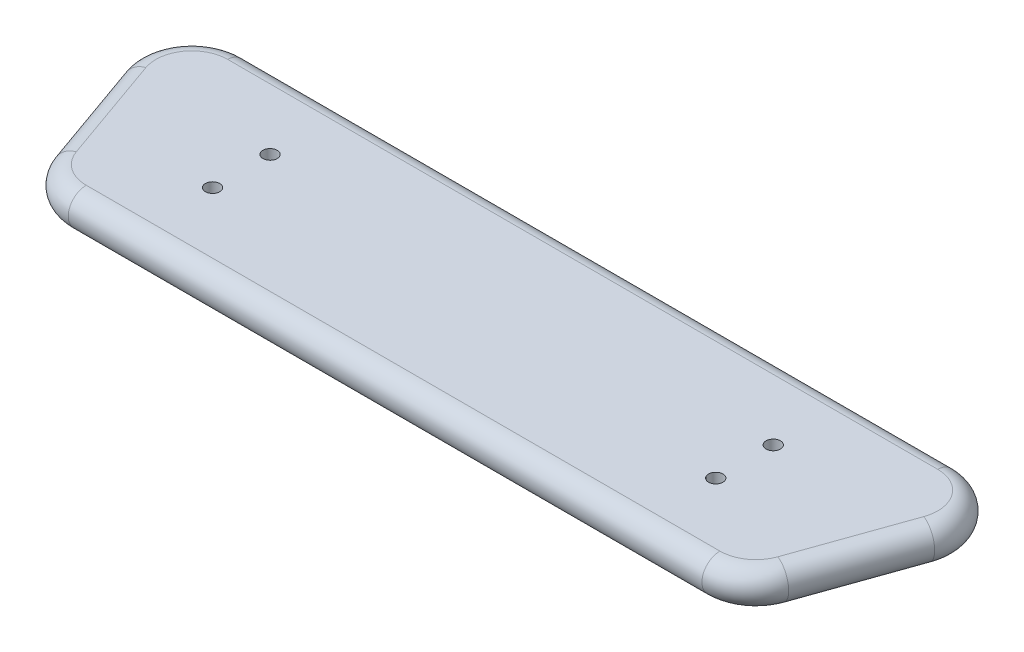
ISO-10303-21;
HEADER;
FILE_DESCRIPTION(('STEP AP214'),'2;1');
FILE_NAME('part.step','',(''),(''),'','','');
FILE_SCHEMA(('AUTOMOTIVE_DESIGN { 1 0 10303 214 1 1 1 1 }'));
ENDSEC;
DATA;
#1=APPLICATION_CONTEXT('core data for automotive mechanical design processes');
#2=APPLICATION_PROTOCOL_DEFINITION('international standard','automotive_design',2000,#1);
#3=PRODUCT_CONTEXT('',#1,'mechanical');
#4=PRODUCT('Part','Part','',(#3));
#5=PRODUCT_RELATED_PRODUCT_CATEGORY('part','',(#4));
#6=PRODUCT_DEFINITION_FORMATION('','',#4);
#7=PRODUCT_DEFINITION_CONTEXT('part definition',#1,'design');
#8=PRODUCT_DEFINITION('design','',#6,#7);
#9=PRODUCT_DEFINITION_SHAPE('','',#8);
#10=(LENGTH_UNIT() NAMED_UNIT(*) SI_UNIT(.MILLI.,.METRE.));
#11=(NAMED_UNIT(*) PLANE_ANGLE_UNIT() SI_UNIT($,.RADIAN.));
#12=(NAMED_UNIT(*) SI_UNIT($,.STERADIAN.) SOLID_ANGLE_UNIT());
#13=UNCERTAINTY_MEASURE_WITH_UNIT(LENGTH_MEASURE(1.E-05),#10,'distance_accuracy_value','');
#14=(GEOMETRIC_REPRESENTATION_CONTEXT(3) GLOBAL_UNCERTAINTY_ASSIGNED_CONTEXT((#13)) GLOBAL_UNIT_ASSIGNED_CONTEXT((#10,
#11,#12)) REPRESENTATION_CONTEXT('',''));
#15=CARTESIAN_POINT('',(0.,0.,0.));
#16=DIRECTION('',(0.,0.,1.));
#17=DIRECTION('',(1.,0.,0.));
#18=AXIS2_PLACEMENT_3D('',#15,#16,#17);
#19=CARTESIAN_POINT('',(-88.1519337423437,5.,19.9928971114934));
#20=DIRECTION('',(1.,0.,0.));
#21=DIRECTION('',(0.,0.,-1.));
#22=AXIS2_PLACEMENT_3D('',#19,#20,#21);
#23=CYLINDRICAL_SURFACE('',#22,5.);
#24=CARTESIAN_POINT('',(88.1519337423434,5.,19.9928971114934));
#25=DIRECTION('',(1.,0.,0.));
#26=DIRECTION('',(0.,0.,-1.));
#27=AXIS2_PLACEMENT_3D('',#24,#25,#26);
#28=CIRCLE('',#27,5.);
#29=CARTESIAN_POINT('',(88.1519337423434,10.,19.9928971114934));
#30=VERTEX_POINT('',#29);
#31=CARTESIAN_POINT('',(88.1519337423434,0.,19.9928971114934));
#32=VERTEX_POINT('',#31);
#33=EDGE_CURVE('E11',#30,#32,#28,.T.);
#34=ORIENTED_EDGE('',*,*,#33,.F.);
#35=DIRECTION('',(1.,0.,0.));
#36=VECTOR('',#35,1.);
#37=CARTESIAN_POINT('',(88.1519337423434,10.,19.9928971114934));
#38=LINE('',#37,#36);
#39=CARTESIAN_POINT('',(-88.1519337423437,10.,19.9928971114934));
#40=VERTEX_POINT('',#39);
#41=EDGE_CURVE('E125',#40,#30,#38,.T.);
#42=ORIENTED_EDGE('',*,*,#41,.F.);
#43=CARTESIAN_POINT('',(-88.1519337423437,5.,19.9928971114934));
#44=DIRECTION('',(1.,0.,0.));
#45=DIRECTION('',(0.,0.,-1.));
#46=AXIS2_PLACEMENT_3D('',#43,#44,#45);
#47=CIRCLE('',#46,5.);
#48=CARTESIAN_POINT('',(-88.1519337423437,0.,19.9928971114934));
#49=VERTEX_POINT('',#48);
#50=EDGE_CURVE('E53',#40,#49,#47,.T.);
#51=ORIENTED_EDGE('',*,*,#50,.T.);
#52=DIRECTION('',(-1.,0.,0.));
#53=VECTOR('',#52,1.);
#54=CARTESIAN_POINT('',(-88.1519337423437,0.,19.9928971114934));
#55=LINE('',#54,#53);
#56=EDGE_CURVE('E152',#32,#49,#55,.T.);
#57=ORIENTED_EDGE('',*,*,#56,.F.);
#58=EDGE_LOOP('',(#34,#42,#51,#57));
#59=FACE_BOUND('',#58,.T.);
#60=ADVANCED_FACE('F45',(#59),#23,.T.);
#61=CARTESIAN_POINT('',(-88.1519337423437,5.,9.99289711149338));
#62=DIRECTION('',(0.,1.,0.));
#63=DIRECTION('',(0.,0.,1.));
#64=AXIS2_PLACEMENT_3D('',#61,#62,#63);
#65=TOROIDAL_SURFACE('',#64,10.,5.);
#66=ORIENTED_EDGE('',*,*,#50,.F.);
#67=CARTESIAN_POINT('',(-88.1519337423437,10.,9.99289711149338));
#68=DIRECTION('',(0.,-1.,0.));
#69=DIRECTION('',(0.,0.,-1.));
#70=AXIS2_PLACEMENT_3D('',#67,#68,#69);
#71=CIRCLE('',#70,10.);
#72=CARTESIAN_POINT('',(-97.5783486532655,10.,13.3309657038311));
#73=VERTEX_POINT('',#72);
#74=EDGE_CURVE('E112',#73,#40,#71,.F.);
#75=ORIENTED_EDGE('',*,*,#74,.F.);
#76=CARTESIAN_POINT('',(-97.5783486532655,5.,13.3309657038311));
#77=DIRECTION('',(0.333806859233767,0.,0.94264149109218));
#78=DIRECTION('',(0.94264149109218,0.,-0.333806859233767));
#79=AXIS2_PLACEMENT_3D('',#76,#77,#78);
#80=CIRCLE('',#79,5.);
#81=CARTESIAN_POINT('',(-97.5783486532655,0.,13.3309657038311));
#82=VERTEX_POINT('',#81);
#83=EDGE_CURVE('E119',#73,#82,#80,.T.);
#84=ORIENTED_EDGE('',*,*,#83,.T.);
#85=CARTESIAN_POINT('',(-88.1519337423437,0.,9.99289711149338));
#86=DIRECTION('',(0.,-1.,0.));
#87=DIRECTION('',(0.,0.,-1.));
#88=AXIS2_PLACEMENT_3D('',#85,#86,#87);
#89=CIRCLE('',#88,10.);
#90=EDGE_CURVE('E114',#49,#82,#89,.T.);
#91=ORIENTED_EDGE('',*,*,#90,.F.);
#92=EDGE_LOOP('',(#66,#75,#84,#91));
#93=FACE_BOUND('',#92,.T.);
#94=ADVANCED_FACE('F111',(#93),#65,.T.);
#95=CARTESIAN_POINT('',(-108.201905829186,5.,-16.6690342961689));
#96=DIRECTION('',(0.333806859233768,0.,0.94264149109218));
#97=DIRECTION('',(0.94264149109218,0.,-0.333806859233768));
#98=AXIS2_PLACEMENT_3D('',#95,#96,#97);
#99=CYLINDRICAL_SURFACE('',#98,5.);
#100=ORIENTED_EDGE('',*,*,#83,.F.);
#101=DIRECTION('',(0.333806859233768,0.,0.94264149109218));
#102=VECTOR('',#101,1.);
#103=CARTESIAN_POINT('',(-77.9333342134071,10.,68.8067751183617));
#104=LINE('',#103,#102);
#105=CARTESIAN_POINT('',(-108.201905829186,10.,-16.6690342961689));
#106=VERTEX_POINT('',#105);
#107=EDGE_CURVE('E128',#106,#73,#104,.T.);
#108=ORIENTED_EDGE('',*,*,#107,.F.);
#109=CARTESIAN_POINT('',(-108.201905829186,5.,-16.6690342961689));
#110=DIRECTION('',(0.333806859233768,0.,0.942641491092179));
#111=DIRECTION('',(0.942641491092179,0.,-0.333806859233768));
#112=AXIS2_PLACEMENT_3D('',#109,#110,#111);
#113=CIRCLE('',#112,5.);
#114=CARTESIAN_POINT('',(-108.201905829186,0.,-16.6690342961689));
#115=VERTEX_POINT('',#114);
#116=EDGE_CURVE('E179',#106,#115,#113,.T.);
#117=ORIENTED_EDGE('',*,*,#116,.T.);
#118=DIRECTION('',(-0.333806859233768,0.,-0.94264149109218));
#119=VECTOR('',#118,1.);
#120=CARTESIAN_POINT('',(-108.201905829186,0.,-16.6690342961689));
#121=LINE('',#120,#119);
#122=EDGE_CURVE('E155',#82,#115,#121,.T.);
#123=ORIENTED_EDGE('',*,*,#122,.F.);
#124=EDGE_LOOP('',(#100,#108,#117,#123));
#125=FACE_BOUND('',#124,.T.);
#126=ADVANCED_FACE('F183',(#125),#99,.T.);
#127=CARTESIAN_POINT('',(-98.7754909182645,5.,-20.0071028885066));
#128=DIRECTION('',(0.,1.,0.));
#129=DIRECTION('',(0.,0.,1.));
#130=AXIS2_PLACEMENT_3D('',#127,#128,#129);
#131=TOROIDAL_SURFACE('',#130,10.,5.);
#132=ORIENTED_EDGE('',*,*,#116,.F.);
#133=CARTESIAN_POINT('',(-98.7754909182645,10.,-20.0071028885066));
#134=DIRECTION('',(0.,-1.,0.));
#135=DIRECTION('',(0.,0.,-1.));
#136=AXIS2_PLACEMENT_3D('',#133,#134,#135);
#137=CIRCLE('',#136,10.);
#138=CARTESIAN_POINT('',(-98.7754909182645,10.,-30.0071028885066));
#139=VERTEX_POINT('',#138);
#140=EDGE_CURVE('E139',#139,#106,#137,.F.);
#141=ORIENTED_EDGE('',*,*,#140,.F.);
#142=CARTESIAN_POINT('',(-98.7754909182645,5.,-30.0071028885066));
#143=DIRECTION('',(-1.,0.,0.));
#144=DIRECTION('',(0.,-1.,0.));
#145=AXIS2_PLACEMENT_3D('',#142,#143,#144);
#146=CIRCLE('',#145,5.);
#147=CARTESIAN_POINT('',(-98.7754909182645,0.,-30.0071028885066));
#148=VERTEX_POINT('',#147);
#149=EDGE_CURVE('E177',#139,#148,#146,.T.);
#150=ORIENTED_EDGE('',*,*,#149,.T.);
#151=CARTESIAN_POINT('',(-98.7754909182645,0.,-20.0071028885066));
#152=DIRECTION('',(0.,-1.,0.));
#153=DIRECTION('',(0.,0.,-1.));
#154=AXIS2_PLACEMENT_3D('',#151,#152,#153);
#155=CIRCLE('',#154,10.);
#156=EDGE_CURVE('E158',#115,#148,#155,.T.);
#157=ORIENTED_EDGE('',*,*,#156,.F.);
#158=EDGE_LOOP('',(#132,#141,#150,#157));
#159=FACE_BOUND('',#158,.T.);
#160=ADVANCED_FACE('F197',(#159),#131,.T.);
#161=CARTESIAN_POINT('',(98.7754909182645,5.,-30.0071028885066));
#162=DIRECTION('',(-1.,0.,0.));
#163=DIRECTION('',(0.,0.,1.));
#164=AXIS2_PLACEMENT_3D('',#161,#162,#163);
#165=CYLINDRICAL_SURFACE('',#164,5.);
#166=ORIENTED_EDGE('',*,*,#149,.F.);
#167=DIRECTION('',(-1.,0.,0.));
#168=VECTOR('',#167,1.);
#169=CARTESIAN_POINT('',(88.1519337423434,10.,-30.0071028885067));
#170=LINE('',#169,#168);
#171=CARTESIAN_POINT('',(98.7754909182645,10.,-30.0071028885067));
#172=VERTEX_POINT('',#171);
#173=EDGE_CURVE('E141',#172,#139,#170,.T.);
#174=ORIENTED_EDGE('',*,*,#173,.F.);
#175=CARTESIAN_POINT('',(98.7754909182645,5.,-30.0071028885066));
#176=DIRECTION('',(-1.,0.,0.));
#177=DIRECTION('',(0.,0.,1.));
#178=AXIS2_PLACEMENT_3D('',#175,#176,#177);
#179=CIRCLE('',#178,5.);
#180=CARTESIAN_POINT('',(98.7754909182645,0.,-30.0071028885067));
#181=VERTEX_POINT('',#180);
#182=EDGE_CURVE('E175',#172,#181,#179,.T.);
#183=ORIENTED_EDGE('',*,*,#182,.T.);
#184=DIRECTION('',(1.,0.,0.));
#185=VECTOR('',#184,1.);
#186=CARTESIAN_POINT('',(98.7754909182645,0.,-30.0071028885066));
#187=LINE('',#186,#185);
#188=EDGE_CURVE('E161',#148,#181,#187,.T.);
#189=ORIENTED_EDGE('',*,*,#188,.F.);
#190=EDGE_LOOP('',(#166,#174,#183,#189));
#191=FACE_BOUND('',#190,.T.);
#192=ADVANCED_FACE('F195',(#191),#165,.T.);
#193=CARTESIAN_POINT('',(98.7754909182645,5.,-20.0071028885066));
#194=DIRECTION('',(0.,1.,0.));
#195=DIRECTION('',(0.,0.,1.));
#196=AXIS2_PLACEMENT_3D('',#193,#194,#195);
#197=TOROIDAL_SURFACE('',#196,10.,5.);
#198=ORIENTED_EDGE('',*,*,#182,.F.);
#199=CARTESIAN_POINT('',(98.7754909182645,10.,-20.0071028885066));
#200=DIRECTION('',(0.,-1.,0.));
#201=DIRECTION('',(0.,0.,-1.));
#202=AXIS2_PLACEMENT_3D('',#199,#200,#201);
#203=CIRCLE('',#202,10.);
#204=CARTESIAN_POINT('',(108.201905829186,10.,-16.6690342961689));
#205=VERTEX_POINT('',#204);
#206=EDGE_CURVE('E144',#205,#172,#203,.F.);
#207=ORIENTED_EDGE('',*,*,#206,.F.);
#208=CARTESIAN_POINT('',(108.201905829186,5.,-16.6690342961689));
#209=DIRECTION('',(0.333806859233774,0.,-0.942641491092177));
#210=DIRECTION('',(-0.942641491092177,0.,-0.333806859233774));
#211=AXIS2_PLACEMENT_3D('',#208,#209,#210);
#212=CIRCLE('',#211,5.);
#213=CARTESIAN_POINT('',(108.201905829186,0.,-16.6690342961689));
#214=VERTEX_POINT('',#213);
#215=EDGE_CURVE('E68',#205,#214,#212,.T.);
#216=ORIENTED_EDGE('',*,*,#215,.T.);
#217=CARTESIAN_POINT('',(98.7754909182645,0.,-20.0071028885066));
#218=DIRECTION('',(0.,-1.,0.));
#219=DIRECTION('',(0.,0.,-1.));
#220=AXIS2_PLACEMENT_3D('',#217,#218,#219);
#221=CIRCLE('',#220,10.);
#222=EDGE_CURVE('E164',#181,#214,#221,.T.);
#223=ORIENTED_EDGE('',*,*,#222,.F.);
#224=EDGE_LOOP('',(#198,#207,#216,#223));
#225=FACE_BOUND('',#224,.T.);
#226=ADVANCED_FACE('F191',(#225),#197,.T.);
#227=CARTESIAN_POINT('',(97.5783486532652,5.,13.3309657038312));
#228=DIRECTION('',(0.333806859233775,0.,-0.942641491092177));
#229=DIRECTION('',(-0.942641491092177,0.,-0.333806859233775));
#230=AXIS2_PLACEMENT_3D('',#227,#228,#229);
#231=CYLINDRICAL_SURFACE('',#230,5.);
#232=ORIENTED_EDGE('',*,*,#215,.F.);
#233=DIRECTION('',(0.333806859233775,0.,-0.942641491092177));
#234=VECTOR('',#233,1.);
#235=CARTESIAN_POINT('',(97.5783486532652,10.,13.3309657038312));
#236=LINE('',#235,#234);
#237=CARTESIAN_POINT('',(97.5783486532652,10.,13.3309657038312));
#238=VERTEX_POINT('',#237);
#239=EDGE_CURVE('E147',#238,#205,#236,.T.);
#240=ORIENTED_EDGE('',*,*,#239,.F.);
#241=CARTESIAN_POINT('',(97.5783486532652,5.,13.3309657038312));
#242=DIRECTION('',(0.333806859233775,0.,-0.942641491092177));
#243=DIRECTION('',(-0.942641491092177,0.,-0.333806859233775));
#244=AXIS2_PLACEMENT_3D('',#241,#242,#243);
#245=CIRCLE('',#244,5.);
#246=CARTESIAN_POINT('',(97.5783486532652,0.,13.3309657038312));
#247=VERTEX_POINT('',#246);
#248=EDGE_CURVE('E60',#238,#247,#245,.T.);
#249=ORIENTED_EDGE('',*,*,#248,.T.);
#250=DIRECTION('',(-0.333806859233775,0.,0.942641491092177));
#251=VECTOR('',#250,1.);
#252=CARTESIAN_POINT('',(97.5783486532652,0.,13.3309657038312));
#253=LINE('',#252,#251);
#254=EDGE_CURVE('E167',#214,#247,#253,.T.);
#255=ORIENTED_EDGE('',*,*,#254,.F.);
#256=EDGE_LOOP('',(#232,#240,#249,#255));
#257=FACE_BOUND('',#256,.T.);
#258=ADVANCED_FACE('F189',(#257),#231,.T.);
#259=CARTESIAN_POINT('',(88.1519337423434,5.,9.99289711149341));
#260=DIRECTION('',(0.,1.,0.));
#261=DIRECTION('',(0.,0.,1.));
#262=AXIS2_PLACEMENT_3D('',#259,#260,#261);
#263=TOROIDAL_SURFACE('',#262,10.,5.);
#264=CARTESIAN_POINT('',(88.1519337423434,10.,9.99289711149341));
#265=DIRECTION('',(0.,-1.,0.));
#266=DIRECTION('',(0.,0.,-1.));
#267=AXIS2_PLACEMENT_3D('',#264,#265,#266);
#268=CIRCLE('',#267,10.);
#269=EDGE_CURVE('E150',#30,#238,#268,.F.);
#270=ORIENTED_EDGE('',*,*,#269,.F.);
#271=ORIENTED_EDGE('',*,*,#33,.T.);
#272=CARTESIAN_POINT('',(88.1519337423434,0.,9.99289711149341));
#273=DIRECTION('',(0.,-1.,0.));
#274=DIRECTION('',(0.,0.,-1.));
#275=AXIS2_PLACEMENT_3D('',#272,#273,#274);
#276=CIRCLE('',#275,10.);
#277=EDGE_CURVE('E170',#247,#32,#276,.T.);
#278=ORIENTED_EDGE('',*,*,#277,.F.);
#279=ORIENTED_EDGE('',*,*,#248,.F.);
#280=EDGE_LOOP('',(#270,#271,#278,#279));
#281=FACE_BOUND('',#280,.T.);
#282=ADVANCED_FACE('F188',(#281),#263,.T.);
#283=CARTESIAN_POINT('',(88.1519337423434,10.,9.99289711149341));
#284=DIRECTION('',(0.,-1.,0.));
#285=DIRECTION('',(0.,0.,-1.));
#286=AXIS2_PLACEMENT_3D('',#283,#284,#285);
#287=PLANE('',#286);
#288=CARTESIAN_POINT('',(69.9999999999999,10.,2.99289711149415));
#289=DIRECTION('',(0.,-1.,0.));
#290=DIRECTION('',(0.,0.,1.));
#291=AXIS2_PLACEMENT_3D('',#288,#289,#290);
#292=CIRCLE('',#291,1.99999999999999);
#293=CARTESIAN_POINT('',(69.9999999999999,10.,4.99289711149414));
#294=VERTEX_POINT('',#293);
#295=EDGE_CURVE('E296',#294,#294,#292,.T.);
#296=ORIENTED_EDGE('',*,*,#295,.T.);
#297=EDGE_LOOP('',(#296));
#298=FACE_BOUND('',#297,.T.);
#299=CARTESIAN_POINT('',(70.,10.,-13.0071028885059));
#300=DIRECTION('',(0.,-1.,0.));
#301=DIRECTION('',(0.,0.,-1.));
#302=AXIS2_PLACEMENT_3D('',#299,#300,#301);
#303=CIRCLE('',#302,2.);
#304=CARTESIAN_POINT('',(70.,10.,-15.0071028885059));
#305=VERTEX_POINT('',#304);
#306=EDGE_CURVE('E290',#305,#305,#303,.T.);
#307=ORIENTED_EDGE('',*,*,#306,.T.);
#308=EDGE_LOOP('',(#307));
#309=FACE_BOUND('',#308,.T.);
#310=CARTESIAN_POINT('',(-70.,10.,-13.0071028885066));
#311=DIRECTION('',(0.,-1.,0.));
#312=DIRECTION('',(0.,0.,1.));
#313=AXIS2_PLACEMENT_3D('',#310,#311,#312);
#314=CIRCLE('',#313,2.);
#315=CARTESIAN_POINT('',(-70.,10.,-11.0071028885066));
#316=VERTEX_POINT('',#315);
#317=EDGE_CURVE('E279',#316,#316,#314,.T.);
#318=ORIENTED_EDGE('',*,*,#317,.T.);
#319=EDGE_LOOP('',(#318));
#320=FACE_BOUND('',#319,.T.);
#321=CARTESIAN_POINT('',(-70.,10.,2.99289711149337));
#322=DIRECTION('',(0.,-1.,0.));
#323=DIRECTION('',(0.,0.,-1.));
#324=AXIS2_PLACEMENT_3D('',#321,#322,#323);
#325=CIRCLE('',#324,2.);
#326=CARTESIAN_POINT('',(-70.,10.,0.992897111493374));
#327=VERTEX_POINT('',#326);
#328=EDGE_CURVE('E131',#327,#327,#325,.T.);
#329=ORIENTED_EDGE('',*,*,#328,.T.);
#330=EDGE_LOOP('',(#329));
#331=FACE_BOUND('',#330,.T.);
#332=ORIENTED_EDGE('',*,*,#41,.T.);
#333=ORIENTED_EDGE('',*,*,#269,.T.);
#334=ORIENTED_EDGE('',*,*,#239,.T.);
#335=ORIENTED_EDGE('',*,*,#206,.T.);
#336=ORIENTED_EDGE('',*,*,#173,.T.);
#337=ORIENTED_EDGE('',*,*,#140,.T.);
#338=ORIENTED_EDGE('',*,*,#107,.T.);
#339=ORIENTED_EDGE('',*,*,#74,.T.);
#340=EDGE_LOOP('',(#332,#333,#334,#335,#336,#337,#338,#339));
#341=FACE_BOUND('',#340,.T.);
#342=ADVANCED_FACE('F123',(#298,#309,#320,#331,#341),#287,.F.);
#343=CARTESIAN_POINT('',(88.1519337423434,0.,9.99289711149341));
#344=DIRECTION('',(0.,-1.,0.));
#345=DIRECTION('',(0.,0.,-1.));
#346=AXIS2_PLACEMENT_3D('',#343,#344,#345);
#347=PLANE('',#346);
#348=ORIENTED_EDGE('',*,*,#254,.T.);
#349=ORIENTED_EDGE('',*,*,#277,.T.);
#350=ORIENTED_EDGE('',*,*,#56,.T.);
#351=ORIENTED_EDGE('',*,*,#90,.T.);
#352=ORIENTED_EDGE('',*,*,#122,.T.);
#353=ORIENTED_EDGE('',*,*,#156,.T.);
#354=ORIENTED_EDGE('',*,*,#188,.T.);
#355=ORIENTED_EDGE('',*,*,#222,.T.);
#356=EDGE_LOOP('',(#348,#349,#350,#351,#352,#353,#354,#355));
#357=FACE_BOUND('',#356,.T.);
#358=ADVANCED_FACE('F186',(#357),#347,.T.);
#359=CARTESIAN_POINT('',(-70.,10.,2.99289711149337));
#360=DIRECTION('',(0.,-1.,0.));
#361=DIRECTION('',(0.,0.,-1.));
#362=AXIS2_PLACEMENT_3D('',#359,#360,#361);
#363=CYLINDRICAL_SURFACE('',#362,2.);
#364=ORIENTED_EDGE('',*,*,#328,.F.);
#365=EDGE_LOOP('',(#364));
#366=FACE_BOUND('',#365,.T.);
#367=CARTESIAN_POINT('',(-70.,2.,2.99289711149337));
#368=DIRECTION('',(0.,-1.,0.));
#369=DIRECTION('',(0.,0.,-1.));
#370=AXIS2_PLACEMENT_3D('',#367,#368,#369);
#371=CIRCLE('',#370,2.);
#372=CARTESIAN_POINT('',(-70.,2.,0.992897111493374));
#373=VERTEX_POINT('',#372);
#374=EDGE_CURVE('E134',#373,#373,#371,.T.);
#375=ORIENTED_EDGE('',*,*,#374,.T.);
#376=EDGE_LOOP('',(#375));
#377=FACE_BOUND('',#376,.T.);
#378=ADVANCED_FACE('F240',(#366,#377),#363,.F.);
#379=CARTESIAN_POINT('',(-70.,2.,2.99289711149337));
#380=DIRECTION('',(0.,-1.,0.));
#381=DIRECTION('',(0.,0.,-1.));
#382=AXIS2_PLACEMENT_3D('',#379,#380,#381);
#383=PLANE('',#382);
#384=ORIENTED_EDGE('',*,*,#374,.F.);
#385=EDGE_LOOP('',(#384));
#386=FACE_BOUND('',#385,.T.);
#387=ADVANCED_FACE('F246',(#386),#383,.F.);
#388=CARTESIAN_POINT('',(-70.,10.,-13.0071028885066));
#389=DIRECTION('',(0.,-1.,0.));
#390=DIRECTION('',(0.,0.,-1.));
#391=AXIS2_PLACEMENT_3D('',#388,#389,#390);
#392=CYLINDRICAL_SURFACE('',#391,2.);
#393=ORIENTED_EDGE('',*,*,#317,.F.);
#394=EDGE_LOOP('',(#393));
#395=FACE_BOUND('',#394,.T.);
#396=CARTESIAN_POINT('',(-70.,2.,-13.0071028885066));
#397=DIRECTION('',(0.,-1.,0.));
#398=DIRECTION('',(0.,0.,1.));
#399=AXIS2_PLACEMENT_3D('',#396,#397,#398);
#400=CIRCLE('',#399,2.);
#401=CARTESIAN_POINT('',(-70.,2.,-11.0071028885066));
#402=VERTEX_POINT('',#401);
#403=EDGE_CURVE('E282',#402,#402,#400,.T.);
#404=ORIENTED_EDGE('',*,*,#403,.T.);
#405=EDGE_LOOP('',(#404));
#406=FACE_BOUND('',#405,.T.);
#407=ADVANCED_FACE('F250',(#395,#406),#392,.F.);
#408=CARTESIAN_POINT('',(-70.,2.,-13.0071028885066));
#409=DIRECTION('',(0.,1.,0.));
#410=DIRECTION('',(0.,0.,1.));
#411=AXIS2_PLACEMENT_3D('',#408,#409,#410);
#412=PLANE('',#411);
#413=ORIENTED_EDGE('',*,*,#403,.F.);
#414=EDGE_LOOP('',(#413));
#415=FACE_BOUND('',#414,.T.);
#416=ADVANCED_FACE('F267',(#415),#412,.T.);
#417=CARTESIAN_POINT('',(70.,10.,-13.0071028885059));
#418=DIRECTION('',(0.,-1.,0.));
#419=DIRECTION('',(0.,0.,-1.));
#420=AXIS2_PLACEMENT_3D('',#417,#418,#419);
#421=CYLINDRICAL_SURFACE('',#420,2.);
#422=ORIENTED_EDGE('',*,*,#306,.F.);
#423=EDGE_LOOP('',(#422));
#424=FACE_BOUND('',#423,.T.);
#425=CARTESIAN_POINT('',(70.,2.,-13.0071028885059));
#426=DIRECTION('',(0.,-1.,0.));
#427=DIRECTION('',(0.,0.,-1.));
#428=AXIS2_PLACEMENT_3D('',#425,#426,#427);
#429=CIRCLE('',#428,2.);
#430=CARTESIAN_POINT('',(70.,2.,-15.0071028885059));
#431=VERTEX_POINT('',#430);
#432=EDGE_CURVE('E285',#431,#431,#429,.T.);
#433=ORIENTED_EDGE('',*,*,#432,.T.);
#434=EDGE_LOOP('',(#433));
#435=FACE_BOUND('',#434,.T.);
#436=ADVANCED_FACE('F263',(#424,#435),#421,.F.);
#437=CARTESIAN_POINT('',(70.,2.,-13.0071028885059));
#438=DIRECTION('',(0.,-1.,0.));
#439=DIRECTION('',(0.,0.,-1.));
#440=AXIS2_PLACEMENT_3D('',#437,#438,#439);
#441=PLANE('',#440);
#442=ORIENTED_EDGE('',*,*,#432,.F.);
#443=EDGE_LOOP('',(#442));
#444=FACE_BOUND('',#443,.T.);
#445=ADVANCED_FACE('F259',(#444),#441,.F.);
#446=CARTESIAN_POINT('',(69.9999999999999,10.,2.99289711149415));
#447=DIRECTION('',(0.,-1.,0.));
#448=DIRECTION('',(0.,0.,-1.));
#449=AXIS2_PLACEMENT_3D('',#446,#447,#448);
#450=CYLINDRICAL_SURFACE('',#449,1.99999999999999);
#451=ORIENTED_EDGE('',*,*,#295,.F.);
#452=EDGE_LOOP('',(#451));
#453=FACE_BOUND('',#452,.T.);
#454=CARTESIAN_POINT('',(69.9999999999999,2.,2.99289711149415));
#455=DIRECTION('',(0.,-1.,0.));
#456=DIRECTION('',(0.,0.,1.));
#457=AXIS2_PLACEMENT_3D('',#454,#455,#456);
#458=CIRCLE('',#457,1.99999999999999);
#459=CARTESIAN_POINT('',(69.9999999999999,2.,4.99289711149414));
#460=VERTEX_POINT('',#459);
#461=EDGE_CURVE('E293',#460,#460,#458,.T.);
#462=ORIENTED_EDGE('',*,*,#461,.T.);
#463=EDGE_LOOP('',(#462));
#464=FACE_BOUND('',#463,.T.);
#465=ADVANCED_FACE('F255',(#453,#464),#450,.F.);
#466=CARTESIAN_POINT('',(69.9999999999999,2.,2.99289711149415));
#467=DIRECTION('',(0.,1.,0.));
#468=DIRECTION('',(0.,0.,1.));
#469=AXIS2_PLACEMENT_3D('',#466,#467,#468);
#470=PLANE('',#469);
#471=ORIENTED_EDGE('',*,*,#461,.F.);
#472=EDGE_LOOP('',(#471));
#473=FACE_BOUND('',#472,.T.);
#474=ADVANCED_FACE('F252',(#473),#470,.T.);
#475=CLOSED_SHELL('',(#60,#94,#126,#160,#192,#226,#258,#282,#342,#358,#378,#387,#407,#416,#436,
#445,#465,#474));
#476=MANIFOLD_SOLID_BREP('B2',#475);
#477=ADVANCED_BREP_SHAPE_REPRESENTATION('',(#18,#476),#14);
#478=SHAPE_DEFINITION_REPRESENTATION(#9,#477);
ENDSEC;
END-ISO-10303-21;
